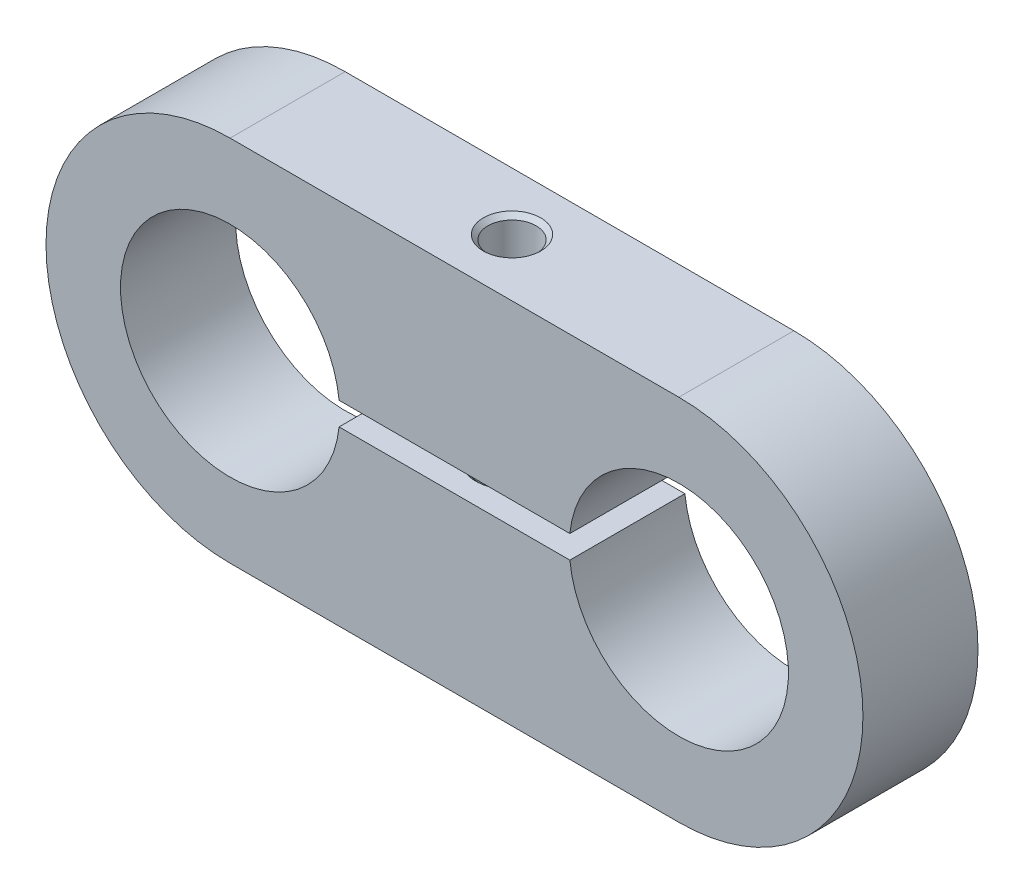
ISO-10303-21;
HEADER;
FILE_DESCRIPTION(('STEP AP214'),'2;1');
FILE_NAME('part.step','',(''),(''),'','','');
FILE_SCHEMA(('AUTOMOTIVE_DESIGN { 1 0 10303 214 1 1 1 1 }'));
ENDSEC;
DATA;
#1=APPLICATION_CONTEXT('core data for automotive mechanical design processes');
#2=APPLICATION_PROTOCOL_DEFINITION('international standard','automotive_design',2000,#1);
#3=PRODUCT_CONTEXT('',#1,'mechanical');
#4=PRODUCT('Part','Part','',(#3));
#5=PRODUCT_RELATED_PRODUCT_CATEGORY('part','',(#4));
#6=PRODUCT_DEFINITION_FORMATION('','',#4);
#7=PRODUCT_DEFINITION_CONTEXT('part definition',#1,'design');
#8=PRODUCT_DEFINITION('design','',#6,#7);
#9=PRODUCT_DEFINITION_SHAPE('','',#8);
#10=(LENGTH_UNIT() NAMED_UNIT(*) SI_UNIT(.MILLI.,.METRE.));
#11=(NAMED_UNIT(*) PLANE_ANGLE_UNIT() SI_UNIT($,.RADIAN.));
#12=(NAMED_UNIT(*) SI_UNIT($,.STERADIAN.) SOLID_ANGLE_UNIT());
#13=UNCERTAINTY_MEASURE_WITH_UNIT(LENGTH_MEASURE(1.E-05),#10,'distance_accuracy_value','');
#14=(GEOMETRIC_REPRESENTATION_CONTEXT(3) GLOBAL_UNCERTAINTY_ASSIGNED_CONTEXT((#13)) GLOBAL_UNIT_ASSIGNED_CONTEXT((#10,
#11,#12)) REPRESENTATION_CONTEXT('',''));
#15=CARTESIAN_POINT('',(0.,0.,0.));
#16=DIRECTION('',(0.,0.,1.));
#17=DIRECTION('',(1.,0.,0.));
#18=AXIS2_PLACEMENT_3D('',#15,#16,#17);
#19=CARTESIAN_POINT('',(0.,0.,10.));
#20=DIRECTION('',(0.,0.,-1.));
#21=DIRECTION('',(-1.,0.,0.));
#22=AXIS2_PLACEMENT_3D('',#19,#20,#21);
#23=CYLINDRICAL_SURFACE('',#22,16.);
#24=CARTESIAN_POINT('',(0.,0.,0.));
#25=DIRECTION('',(0.,0.,-1.));
#26=DIRECTION('',(-1.,0.,0.));
#27=AXIS2_PLACEMENT_3D('',#24,#25,#26);
#28=CIRCLE('',#27,16.);
#29=CARTESIAN_POINT('',(0.,-16.,0.));
#30=VERTEX_POINT('',#29);
#31=CARTESIAN_POINT('',(0.,16.,0.));
#32=VERTEX_POINT('',#31);
#33=EDGE_CURVE('E123',#30,#32,#28,.T.);
#34=ORIENTED_EDGE('',*,*,#33,.F.);
#35=DIRECTION('',(0.,0.,-1.));
#36=VECTOR('',#35,1.);
#37=CARTESIAN_POINT('',(0.,-16.,10.));
#38=LINE('',#37,#36);
#39=CARTESIAN_POINT('',(0.,-16.,10.));
#40=VERTEX_POINT('',#39);
#41=EDGE_CURVE('E54',#40,#30,#38,.T.);
#42=ORIENTED_EDGE('',*,*,#41,.F.);
#43=CARTESIAN_POINT('',(0.,0.,10.));
#44=DIRECTION('',(0.,0.,-1.));
#45=DIRECTION('',(-1.,0.,0.));
#46=AXIS2_PLACEMENT_3D('',#43,#44,#45);
#47=CIRCLE('',#46,16.);
#48=CARTESIAN_POINT('',(0.,16.,10.));
#49=VERTEX_POINT('',#48);
#50=EDGE_CURVE('E156',#40,#49,#47,.T.);
#51=ORIENTED_EDGE('',*,*,#50,.T.);
#52=DIRECTION('',(0.,0.,-1.));
#53=VECTOR('',#52,1.);
#54=CARTESIAN_POINT('',(0.,16.,10.));
#55=LINE('',#54,#53);
#56=EDGE_CURVE('E83',#49,#32,#55,.T.);
#57=ORIENTED_EDGE('',*,*,#56,.T.);
#58=EDGE_LOOP('',(#34,#42,#51,#57));
#59=FACE_BOUND('',#58,.T.);
#60=ADVANCED_FACE('F37',(#59),#23,.T.);
#61=CARTESIAN_POINT('',(39.,-16.,10.));
#62=DIRECTION('',(0.,-1.,0.));
#63=DIRECTION('',(0.,0.,-1.));
#64=AXIS2_PLACEMENT_3D('',#61,#62,#63);
#65=PLANE('',#64);
#66=CARTESIAN_POINT('',(19.5,-16.,5.));
#67=DIRECTION('',(0.,-1.,0.));
#68=DIRECTION('',(0.,0.,-1.));
#69=AXIS2_PLACEMENT_3D('',#66,#67,#68);
#70=CIRCLE('',#69,3.14999999961537);
#71=CARTESIAN_POINT('',(19.5,-16.,1.85000000038463));
#72=VERTEX_POINT('',#71);
#73=EDGE_CURVE('E11',#72,#72,#70,.F.);
#74=ORIENTED_EDGE('',*,*,#73,.T.);
#75=EDGE_LOOP('',(#74));
#76=FACE_BOUND('',#75,.T.);
#77=DIRECTION('',(-1.,0.,0.));
#78=VECTOR('',#77,1.);
#79=CARTESIAN_POINT('',(39.,-16.,0.));
#80=LINE('',#79,#78);
#81=CARTESIAN_POINT('',(39.,-16.,0.));
#82=VERTEX_POINT('',#81);
#83=EDGE_CURVE('E159',#82,#30,#80,.T.);
#84=ORIENTED_EDGE('',*,*,#83,.F.);
#85=DIRECTION('',(0.,0.,-1.));
#86=VECTOR('',#85,1.);
#87=CARTESIAN_POINT('',(39.,-16.,10.));
#88=LINE('',#87,#86);
#89=CARTESIAN_POINT('',(39.,-16.,10.));
#90=VERTEX_POINT('',#89);
#91=EDGE_CURVE('E72',#90,#82,#88,.T.);
#92=ORIENTED_EDGE('',*,*,#91,.F.);
#93=DIRECTION('',(-1.,0.,0.));
#94=VECTOR('',#93,1.);
#95=CARTESIAN_POINT('',(39.,-16.,10.));
#96=LINE('',#95,#94);
#97=EDGE_CURVE('E163',#90,#40,#96,.T.);
#98=ORIENTED_EDGE('',*,*,#97,.T.);
#99=ORIENTED_EDGE('',*,*,#41,.T.);
#100=EDGE_LOOP('',(#84,#92,#98,#99));
#101=FACE_BOUND('',#100,.T.);
#102=ADVANCED_FACE('F224',(#76,#101),#65,.T.);
#103=CARTESIAN_POINT('',(39.,0.,10.));
#104=DIRECTION('',(0.,0.,-1.));
#105=DIRECTION('',(-1.,0.,0.));
#106=AXIS2_PLACEMENT_3D('',#103,#104,#105);
#107=CYLINDRICAL_SURFACE('',#106,16.);
#108=CARTESIAN_POINT('',(39.,0.,0.));
#109=DIRECTION('',(0.,0.,-1.));
#110=DIRECTION('',(-1.,0.,0.));
#111=AXIS2_PLACEMENT_3D('',#108,#109,#110);
#112=CIRCLE('',#111,16.);
#113=CARTESIAN_POINT('',(39.,16.,0.));
#114=VERTEX_POINT('',#113);
#115=EDGE_CURVE('E170',#114,#82,#112,.T.);
#116=ORIENTED_EDGE('',*,*,#115,.F.);
#117=DIRECTION('',(0.,0.,-1.));
#118=VECTOR('',#117,1.);
#119=CARTESIAN_POINT('',(39.,16.,10.));
#120=LINE('',#119,#118);
#121=CARTESIAN_POINT('',(39.,16.,10.));
#122=VERTEX_POINT('',#121);
#123=EDGE_CURVE('E177',#122,#114,#120,.T.);
#124=ORIENTED_EDGE('',*,*,#123,.F.);
#125=CARTESIAN_POINT('',(39.,0.,10.));
#126=DIRECTION('',(0.,0.,-1.));
#127=DIRECTION('',(-1.,0.,0.));
#128=AXIS2_PLACEMENT_3D('',#125,#126,#127);
#129=CIRCLE('',#128,16.);
#130=EDGE_CURVE('E161',#122,#90,#129,.T.);
#131=ORIENTED_EDGE('',*,*,#130,.T.);
#132=ORIENTED_EDGE('',*,*,#91,.T.);
#133=EDGE_LOOP('',(#116,#124,#131,#132));
#134=FACE_BOUND('',#133,.T.);
#135=ADVANCED_FACE('F229',(#134),#107,.T.);
#136=CARTESIAN_POINT('',(0.,16.,10.));
#137=DIRECTION('',(0.,1.,0.));
#138=DIRECTION('',(-1.,0.,0.));
#139=AXIS2_PLACEMENT_3D('',#136,#137,#138);
#140=PLANE('',#139);
#141=CARTESIAN_POINT('',(19.5,16.,5.));
#142=DIRECTION('',(0.,1.,0.));
#143=DIRECTION('',(-1.,0.,0.));
#144=AXIS2_PLACEMENT_3D('',#141,#142,#143);
#145=CIRCLE('',#144,2.49999999961536);
#146=CARTESIAN_POINT('',(17.0000000003846,16.,5.));
#147=VERTEX_POINT('',#146);
#148=EDGE_CURVE('E46',#147,#147,#145,.F.);
#149=ORIENTED_EDGE('',*,*,#148,.T.);
#150=EDGE_LOOP('',(#149));
#151=FACE_BOUND('',#150,.T.);
#152=DIRECTION('',(1.,0.,0.));
#153=VECTOR('',#152,1.);
#154=CARTESIAN_POINT('',(0.,16.,0.));
#155=LINE('',#154,#153);
#156=EDGE_CURVE('E167',#32,#114,#155,.T.);
#157=ORIENTED_EDGE('',*,*,#156,.F.);
#158=ORIENTED_EDGE('',*,*,#56,.F.);
#159=DIRECTION('',(1.,0.,0.));
#160=VECTOR('',#159,1.);
#161=CARTESIAN_POINT('',(0.,16.,10.));
#162=LINE('',#161,#160);
#163=EDGE_CURVE('E158',#49,#122,#162,.T.);
#164=ORIENTED_EDGE('',*,*,#163,.T.);
#165=ORIENTED_EDGE('',*,*,#123,.T.);
#166=EDGE_LOOP('',(#157,#158,#164,#165));
#167=FACE_BOUND('',#166,.T.);
#168=ADVANCED_FACE('F199',(#151,#167),#140,.T.);
#169=CARTESIAN_POINT('',(0.,0.,10.));
#170=DIRECTION('',(0.,0.,-1.));
#171=DIRECTION('',(-1.,0.,0.));
#172=AXIS2_PLACEMENT_3D('',#169,#170,#171);
#173=PLANE('',#172);
#174=DIRECTION('',(1.,0.,0.));
#175=VECTOR('',#174,1.);
#176=CARTESIAN_POINT('',(10.9544511501033,-0.999999999999987,10.));
#177=LINE('',#176,#175);
#178=CARTESIAN_POINT('',(9.47236111009288,-0.999999999999992,10.));
#179=VERTEX_POINT('',#178);
#180=CARTESIAN_POINT('',(29.5276388899071,-0.999999999999992,10.));
#181=VERTEX_POINT('',#180);
#182=EDGE_CURVE('E129',#179,#181,#177,.T.);
#183=ORIENTED_EDGE('',*,*,#182,.F.);
#184=CARTESIAN_POINT('',(0.,0.,10.));
#185=DIRECTION('',(0.,0.,-1.));
#186=DIRECTION('',(1.,0.,0.));
#187=AXIS2_PLACEMENT_3D('',#184,#185,#186);
#188=CIRCLE('',#187,9.525);
#189=CARTESIAN_POINT('',(9.47236111009288,1.,10.));
#190=VERTEX_POINT('',#189);
#191=EDGE_CURVE('E142',#179,#190,#188,.T.);
#192=ORIENTED_EDGE('',*,*,#191,.T.);
#193=DIRECTION('',(-1.,0.,0.));
#194=VECTOR('',#193,1.);
#195=CARTESIAN_POINT('',(28.0455488498967,1.,10.));
#196=LINE('',#195,#194);
#197=CARTESIAN_POINT('',(29.5276388899071,1.,10.));
#198=VERTEX_POINT('',#197);
#199=EDGE_CURVE('E150',#198,#190,#196,.T.);
#200=ORIENTED_EDGE('',*,*,#199,.F.);
#201=CARTESIAN_POINT('',(39.,0.,10.));
#202=DIRECTION('',(0.,0.,-1.));
#203=DIRECTION('',(-1.,0.,0.));
#204=AXIS2_PLACEMENT_3D('',#201,#202,#203);
#205=CIRCLE('',#204,9.525);
#206=EDGE_CURVE('E138',#198,#181,#205,.T.);
#207=ORIENTED_EDGE('',*,*,#206,.T.);
#208=EDGE_LOOP('',(#183,#192,#200,#207));
#209=FACE_BOUND('',#208,.T.);
#210=ORIENTED_EDGE('',*,*,#50,.F.);
#211=ORIENTED_EDGE('',*,*,#97,.F.);
#212=ORIENTED_EDGE('',*,*,#130,.F.);
#213=ORIENTED_EDGE('',*,*,#163,.F.);
#214=EDGE_LOOP('',(#210,#211,#212,#213));
#215=FACE_BOUND('',#214,.T.);
#216=ADVANCED_FACE('F251',(#209,#215),#173,.F.);
#217=CARTESIAN_POINT('',(0.,0.,0.));
#218=DIRECTION('',(0.,0.,-1.));
#219=DIRECTION('',(-1.,0.,0.));
#220=AXIS2_PLACEMENT_3D('',#217,#218,#219);
#221=PLANE('',#220);
#222=DIRECTION('',(-1.,0.,0.));
#223=VECTOR('',#222,1.);
#224=CARTESIAN_POINT('',(28.0455488498967,1.,0.));
#225=LINE('',#224,#223);
#226=CARTESIAN_POINT('',(29.5276388899071,1.,0.));
#227=VERTEX_POINT('',#226);
#228=CARTESIAN_POINT('',(9.47236111009288,1.,0.));
#229=VERTEX_POINT('',#228);
#230=EDGE_CURVE('E124',#227,#229,#225,.T.);
#231=ORIENTED_EDGE('',*,*,#230,.T.);
#232=CARTESIAN_POINT('',(0.,0.,0.));
#233=DIRECTION('',(0.,0.,-1.));
#234=DIRECTION('',(1.,0.,0.));
#235=AXIS2_PLACEMENT_3D('',#232,#233,#234);
#236=CIRCLE('',#235,9.525);
#237=CARTESIAN_POINT('',(9.47236111009288,-0.999999999999992,0.));
#238=VERTEX_POINT('',#237);
#239=EDGE_CURVE('E119',#238,#229,#236,.T.);
#240=ORIENTED_EDGE('',*,*,#239,.F.);
#241=DIRECTION('',(1.,0.,0.));
#242=VECTOR('',#241,1.);
#243=CARTESIAN_POINT('',(10.9544511501033,-0.999999999999987,0.));
#244=LINE('',#243,#242);
#245=CARTESIAN_POINT('',(29.5276388899071,-0.999999999999992,0.));
#246=VERTEX_POINT('',#245);
#247=EDGE_CURVE('E112',#238,#246,#244,.T.);
#248=ORIENTED_EDGE('',*,*,#247,.T.);
#249=CARTESIAN_POINT('',(39.,0.,0.));
#250=DIRECTION('',(0.,0.,-1.));
#251=DIRECTION('',(-1.,0.,0.));
#252=AXIS2_PLACEMENT_3D('',#249,#250,#251);
#253=CIRCLE('',#252,9.525);
#254=EDGE_CURVE('E117',#227,#246,#253,.T.);
#255=ORIENTED_EDGE('',*,*,#254,.F.);
#256=EDGE_LOOP('',(#231,#240,#248,#255));
#257=FACE_BOUND('',#256,.T.);
#258=ORIENTED_EDGE('',*,*,#33,.T.);
#259=ORIENTED_EDGE('',*,*,#156,.T.);
#260=ORIENTED_EDGE('',*,*,#115,.T.);
#261=ORIENTED_EDGE('',*,*,#83,.T.);
#262=EDGE_LOOP('',(#258,#259,#260,#261));
#263=FACE_BOUND('',#262,.T.);
#264=ADVANCED_FACE('F114',(#257,#263),#221,.T.);
#265=CARTESIAN_POINT('',(10.9544511501033,-0.999999999999987,0.));
#266=DIRECTION('',(0.,-1.,0.));
#267=DIRECTION('',(0.,0.,-1.));
#268=AXIS2_PLACEMENT_3D('',#265,#266,#267);
#269=PLANE('',#268);
#270=CARTESIAN_POINT('',(19.5,-0.999999999999987,5.));
#271=DIRECTION('',(0.,-1.,0.));
#272=DIRECTION('',(0.,0.,-1.));
#273=AXIS2_PLACEMENT_3D('',#270,#271,#272);
#274=CIRCLE('',#273,3.15000000035431);
#275=CARTESIAN_POINT('',(19.5,-0.999999999999987,1.84999999964569));
#276=VERTEX_POINT('',#275);
#277=EDGE_CURVE('E175',#276,#276,#274,.T.);
#278=ORIENTED_EDGE('',*,*,#277,.T.);
#279=EDGE_LOOP('',(#278));
#280=FACE_BOUND('',#279,.T.);
#281=ORIENTED_EDGE('',*,*,#182,.T.);
#282=DIRECTION('',(0.,0.,1.));
#283=VECTOR('',#282,1.);
#284=CARTESIAN_POINT('',(29.5276388899071,-0.999999999999992,0.));
#285=LINE('',#284,#283);
#286=EDGE_CURVE('E127',#246,#181,#285,.T.);
#287=ORIENTED_EDGE('',*,*,#286,.F.);
#288=ORIENTED_EDGE('',*,*,#247,.F.);
#289=DIRECTION('',(0.,0.,1.));
#290=VECTOR('',#289,1.);
#291=CARTESIAN_POINT('',(9.47236111009288,-0.999999999999992,0.));
#292=LINE('',#291,#290);
#293=EDGE_CURVE('E148',#238,#179,#292,.T.);
#294=ORIENTED_EDGE('',*,*,#293,.T.);
#295=EDGE_LOOP('',(#281,#287,#288,#294));
#296=FACE_BOUND('',#295,.T.);
#297=ADVANCED_FACE('F128',(#280,#296),#269,.F.);
#298=CARTESIAN_POINT('',(28.0455488498967,1.,0.));
#299=DIRECTION('',(0.,1.,0.));
#300=DIRECTION('',(0.,0.,1.));
#301=AXIS2_PLACEMENT_3D('',#298,#299,#300);
#302=PLANE('',#301);
#303=CARTESIAN_POINT('',(19.5,1.,5.));
#304=DIRECTION('',(0.,1.,0.));
#305=DIRECTION('',(0.,0.,1.));
#306=AXIS2_PLACEMENT_3D('',#303,#304,#305);
#307=CIRCLE('',#306,2.50000000035432);
#308=CARTESIAN_POINT('',(19.5,1.,7.50000000035432));
#309=VERTEX_POINT('',#308);
#310=EDGE_CURVE('E188',#309,#309,#307,.T.);
#311=ORIENTED_EDGE('',*,*,#310,.T.);
#312=EDGE_LOOP('',(#311));
#313=FACE_BOUND('',#312,.T.);
#314=ORIENTED_EDGE('',*,*,#199,.T.);
#315=DIRECTION('',(0.,0.,1.));
#316=VECTOR('',#315,1.);
#317=CARTESIAN_POINT('',(9.47236111009288,1.,0.));
#318=LINE('',#317,#316);
#319=EDGE_CURVE('E145',#229,#190,#318,.T.);
#320=ORIENTED_EDGE('',*,*,#319,.F.);
#321=ORIENTED_EDGE('',*,*,#230,.F.);
#322=DIRECTION('',(0.,0.,1.));
#323=VECTOR('',#322,1.);
#324=CARTESIAN_POINT('',(29.5276388899071,1.,0.));
#325=LINE('',#324,#323);
#326=EDGE_CURVE('E133',#227,#198,#325,.T.);
#327=ORIENTED_EDGE('',*,*,#326,.T.);
#328=EDGE_LOOP('',(#314,#320,#321,#327));
#329=FACE_BOUND('',#328,.T.);
#330=ADVANCED_FACE('F219',(#313,#329),#302,.F.);
#331=CARTESIAN_POINT('',(19.5,-16.,5.));
#332=DIRECTION('',(0.,-1.,0.));
#333=DIRECTION('',(0.,0.,-1.));
#334=AXIS2_PLACEMENT_3D('',#331,#332,#333);
#335=CYLINDRICAL_SURFACE('',#334,2.74999999999999);
#336=CARTESIAN_POINT('',(19.5,-1.39999999961535,5.));
#337=DIRECTION('',(0.,-1.,0.));
#338=DIRECTION('',(0.,0.,-1.));
#339=AXIS2_PLACEMENT_3D('',#336,#337,#338);
#340=CIRCLE('',#339,2.74999999999999);
#341=CARTESIAN_POINT('',(19.5,-1.39999999961535,2.25000000000001));
#342=VERTEX_POINT('',#341);
#343=EDGE_CURVE('E185',#342,#342,#340,.F.);
#344=ORIENTED_EDGE('',*,*,#343,.T.);
#345=EDGE_LOOP('',(#344));
#346=FACE_BOUND('',#345,.T.);
#347=CARTESIAN_POINT('',(19.5,-15.5999999996457,5.));
#348=DIRECTION('',(0.,-1.,0.));
#349=DIRECTION('',(0.,0.,-1.));
#350=AXIS2_PLACEMENT_3D('',#347,#348,#349);
#351=CIRCLE('',#350,2.74999999999999);
#352=CARTESIAN_POINT('',(19.5,-15.5999999996457,2.25000000000001));
#353=VERTEX_POINT('',#352);
#354=EDGE_CURVE('E182',#353,#353,#351,.T.);
#355=ORIENTED_EDGE('',*,*,#354,.T.);
#356=EDGE_LOOP('',(#355));
#357=FACE_BOUND('',#356,.T.);
#358=ADVANCED_FACE('F210',(#346,#357),#335,.F.);
#359=CARTESIAN_POINT('',(19.5,16.,5.));
#360=DIRECTION('',(0.,1.,0.));
#361=DIRECTION('',(0.,0.,1.));
#362=AXIS2_PLACEMENT_3D('',#359,#360,#361);
#363=CYLINDRICAL_SURFACE('',#362,2.09999999999999);
#364=CARTESIAN_POINT('',(19.5,1.39999999961537,5.));
#365=DIRECTION('',(0.,1.,0.));
#366=DIRECTION('',(0.,0.,1.));
#367=AXIS2_PLACEMENT_3D('',#364,#365,#366);
#368=CIRCLE('',#367,2.09999999999999);
#369=CARTESIAN_POINT('',(19.5,1.39999999961537,7.09999999999999));
#370=VERTEX_POINT('',#369);
#371=EDGE_CURVE('E194',#370,#370,#368,.F.);
#372=ORIENTED_EDGE('',*,*,#371,.T.);
#373=EDGE_LOOP('',(#372));
#374=FACE_BOUND('',#373,.T.);
#375=CARTESIAN_POINT('',(19.5,15.5999999996457,5.));
#376=DIRECTION('',(0.,1.,0.));
#377=DIRECTION('',(0.,0.,1.));
#378=AXIS2_PLACEMENT_3D('',#375,#376,#377);
#379=CIRCLE('',#378,2.09999999999999);
#380=CARTESIAN_POINT('',(19.5,15.5999999996457,7.09999999999999));
#381=VERTEX_POINT('',#380);
#382=EDGE_CURVE('E191',#381,#381,#379,.T.);
#383=ORIENTED_EDGE('',*,*,#382,.T.);
#384=EDGE_LOOP('',(#383));
#385=FACE_BOUND('',#384,.T.);
#386=ADVANCED_FACE('F207',(#374,#385),#363,.F.);
#387=CARTESIAN_POINT('',(19.5,-0.999999999999987,5.));
#388=DIRECTION('',(0.,1.,0.));
#389=DIRECTION('',(0.,0.,1.));
#390=AXIS2_PLACEMENT_3D('',#387,#388,#389);
#391=CONICAL_SURFACE('',#390,3.15000000035431,0.785398164321151);
#392=ORIENTED_EDGE('',*,*,#343,.F.);
#393=EDGE_LOOP('',(#392));
#394=FACE_BOUND('',#393,.T.);
#395=ORIENTED_EDGE('',*,*,#277,.F.);
#396=EDGE_LOOP('',(#395));
#397=FACE_BOUND('',#396,.T.);
#398=ADVANCED_FACE('F209',(#394,#397),#391,.F.);
#399=CARTESIAN_POINT('',(19.5,1.,5.));
#400=DIRECTION('',(0.,-1.,0.));
#401=DIRECTION('',(0.,0.,-1.));
#402=AXIS2_PLACEMENT_3D('',#399,#400,#401);
#403=CONICAL_SURFACE('',#402,2.50000000035432,0.785398164321154);
#404=ORIENTED_EDGE('',*,*,#371,.F.);
#405=EDGE_LOOP('',(#404));
#406=FACE_BOUND('',#405,.T.);
#407=ORIENTED_EDGE('',*,*,#310,.F.);
#408=EDGE_LOOP('',(#407));
#409=FACE_BOUND('',#408,.T.);
#410=ADVANCED_FACE('F204',(#406,#409),#403,.F.);
#411=CARTESIAN_POINT('',(19.5,15.5999999996457,5.));
#412=DIRECTION('',(0.,1.,0.));
#413=DIRECTION('',(0.,0.,1.));
#414=AXIS2_PLACEMENT_3D('',#411,#412,#413);
#415=CONICAL_SURFACE('',#414,2.09999999999999,0.785398162473745);
#416=ORIENTED_EDGE('',*,*,#148,.F.);
#417=EDGE_LOOP('',(#416));
#418=FACE_BOUND('',#417,.T.);
#419=ORIENTED_EDGE('',*,*,#382,.F.);
#420=EDGE_LOOP('',(#419));
#421=FACE_BOUND('',#420,.T.);
#422=ADVANCED_FACE('F201',(#418,#421),#415,.F.);
#423=CARTESIAN_POINT('',(19.5,-15.5999999996457,5.));
#424=DIRECTION('',(0.,-1.,0.));
#425=DIRECTION('',(0.,0.,-1.));
#426=AXIS2_PLACEMENT_3D('',#423,#424,#425);
#427=CONICAL_SURFACE('',#426,2.74999999999999,0.785398162473744);
#428=CARTESIAN_POINT('',(19.5,-16.,1.85000000038463));
#429=CARTESIAN_POINT('',(19.5,-15.9958333333296,1.85416666704729));
#430=CARTESIAN_POINT('',(19.5,-15.9916666666593,1.85833333370995));
#431=CARTESIAN_POINT('',(19.5,-15.9833333333186,1.86666666703527));
#432=CARTESIAN_POINT('',(19.5,-15.9791666666482,1.87083333369793));
#433=CARTESIAN_POINT('',(19.5,-15.9708333333075,1.87916666702325));
#434=CARTESIAN_POINT('',(19.5,-15.9666666666371,1.88333333368591));
#435=CARTESIAN_POINT('',(19.5,-15.9583333332964,1.89166666701123));
#436=CARTESIAN_POINT('',(19.5,-15.9541666666261,1.89583333367389));
#437=CARTESIAN_POINT('',(19.5,-15.9458333332853,1.90416666699921));
#438=CARTESIAN_POINT('',(19.5,-15.941666666615,1.90833333366187));
#439=CARTESIAN_POINT('',(19.5,-15.9333333332743,1.91666666698719));
#440=CARTESIAN_POINT('',(19.5,-15.9291666666039,1.92083333364985));
#441=CARTESIAN_POINT('',(19.5,-15.9208333332632,1.92916666697517));
#442=CARTESIAN_POINT('',(19.5,-15.9166666665928,1.93333333363783));
#443=CARTESIAN_POINT('',(19.5,-15.9083333332521,1.94166666696316));
#444=CARTESIAN_POINT('',(19.5,-15.9041666665818,1.94583333362582));
#445=CARTESIAN_POINT('',(19.5,-15.8958333332411,1.95416666695114));
#446=CARTESIAN_POINT('',(19.5,-15.8916666665707,1.9583333336138));
#447=CARTESIAN_POINT('',(19.5,-15.88333333323,1.96666666693912));
#448=CARTESIAN_POINT('',(19.5,-15.8791666665596,1.97083333360178));
#449=CARTESIAN_POINT('',(19.5,-15.8708333332189,1.9791666669271));
#450=CARTESIAN_POINT('',(19.5,-15.8666666665486,1.98333333358976));
#451=CARTESIAN_POINT('',(19.5,-15.8583333332078,1.99166666691508));
#452=CARTESIAN_POINT('',(19.5,-15.8541666665375,1.99583333357774));
#453=CARTESIAN_POINT('',(19.5,-15.8458333331968,2.00416666690306));
#454=CARTESIAN_POINT('',(19.5,-15.8416666665264,2.00833333356572));
#455=CARTESIAN_POINT('',(19.5,-15.8333333331857,2.01666666689104));
#456=CARTESIAN_POINT('',(19.5,-15.8291666665153,2.0208333335537));
#457=CARTESIAN_POINT('',(19.5,-15.8208333331746,2.02916666687902));
#458=CARTESIAN_POINT('',(19.5,-15.8166666665043,2.03333333354168));
#459=CARTESIAN_POINT('',(19.5,-15.8083333331635,2.041666666867));
#460=CARTESIAN_POINT('',(19.5,-15.8041666664932,2.04583333352966));
#461=CARTESIAN_POINT('',(19.5,-15.7958333331525,2.05416666685498));
#462=CARTESIAN_POINT('',(19.5,-15.7916666664821,2.05833333351764));
#463=CARTESIAN_POINT('',(19.5,-15.7833333331414,2.06666666684296));
#464=CARTESIAN_POINT('',(19.5,-15.779166666471,2.07083333350562));
#465=CARTESIAN_POINT('',(19.5,-15.7708333331303,2.07916666683094));
#466=CARTESIAN_POINT('',(19.5,-15.76666666646,2.0833333334936));
#467=CARTESIAN_POINT('',(19.5,-15.7583333331192,2.09166666681892));
#468=CARTESIAN_POINT('',(19.5,-15.7541666664489,2.09583333348158));
#469=CARTESIAN_POINT('',(19.5,-15.7458333331082,2.1041666668069));
#470=CARTESIAN_POINT('',(19.5,-15.7416666664378,2.10833333346956));
#471=CARTESIAN_POINT('',(19.5,-15.7333333330971,2.11666666679488));
#472=CARTESIAN_POINT('',(19.5,-15.7291666664267,2.12083333345754));
#473=CARTESIAN_POINT('',(19.5,-15.720833333086,2.12916666678286));
#474=CARTESIAN_POINT('',(19.5,-15.7166666664157,2.13333333344552));
#475=CARTESIAN_POINT('',(19.5,-15.708333333075,2.14166666677084));
#476=CARTESIAN_POINT('',(19.5,-15.7041666664046,2.1458333334335));
#477=CARTESIAN_POINT('',(19.5,-15.6958333330639,2.15416666675882));
#478=CARTESIAN_POINT('',(19.5,-15.6916666663935,2.15833333342148));
#479=CARTESIAN_POINT('',(19.5,-15.6833333330528,2.16666666674681));
#480=CARTESIAN_POINT('',(19.5,-15.6791666663825,2.17083333340946));
#481=CARTESIAN_POINT('',(19.5,-15.6708333330417,2.17916666673479));
#482=CARTESIAN_POINT('',(19.5,-15.6666666663714,2.18333333339745));
#483=CARTESIAN_POINT('',(19.5,-15.6583333330307,2.19166666672277));
#484=CARTESIAN_POINT('',(19.5,-15.6541666663603,2.19583333338543));
#485=CARTESIAN_POINT('',(19.5,-15.6458333330196,2.20416666671075));
#486=CARTESIAN_POINT('',(19.5,-15.6416666663492,2.20833333337341));
#487=CARTESIAN_POINT('',(19.5,-15.6333333330085,2.21666666669873));
#488=CARTESIAN_POINT('',(19.5,-15.6291666663382,2.22083333336139));
#489=CARTESIAN_POINT('',(19.5,-15.6208333329974,2.22916666668671));
#490=CARTESIAN_POINT('',(19.5,-15.6166666663271,2.23333333334937));
#491=CARTESIAN_POINT('',(19.5,-15.6083333329864,2.24166666667469));
#492=CARTESIAN_POINT('',(19.5,-15.604166666316,2.24583333333735));
#493=CARTESIAN_POINT('',(19.5,-15.5999999996457,2.25000000000001));
#494=B_SPLINE_CURVE_WITH_KNOTS('',3,(#428,#429,#430,#431,#432,#433,#434,#435,#436,#437,#438,
#439,#440,#441,#442,#443,#444,#445,#446,#447,#448,#449,#450,#451,#452,#453,#454,#455,#456,#457,
#458,#459,#460,#461,#462,#463,#464,#465,#466,#467,#468,#469,#470,#471,#472,#473,#474,#475,#476,
#477,#478,#479,#480,#481,#482,#483,#484,#485,#486,#487,#488,#489,#490,#491,#492,#493),
.UNSPECIFIED.,.F.,.F.,(4,2,2,2,2,2,2,2,2,2,2,2,2,2,2,2,2,2,2,2,2,2,2,2,2,2,2,2,2,2,2,2,4),(0.,
0.0176776695289945,0.0353553390579889,0.0530330085869837,0.0707106781159781,0.0883883476449726,
0.106066017173967,0.123743686702962,0.141421356231956,0.159099025760951,0.176776695289945,
0.19445436481894,0.212132034347934,0.229809703876929,0.247487373405924,0.265165042934918,
0.282842712463912,0.300520381992907,0.318198051521901,0.335875721050896,0.353553390579891,
0.371231060108885,0.38890872963788,0.406586399166874,0.424264068695869,0.441941738224863,
0.459619407753857,0.477297077282852,0.494974746811847,0.512652416340841,0.530330085869836,
0.54800775539883,0.565685424927825),.UNSPECIFIED.);
#495=EDGE_CURVE('BSEAM39',#72,#353,#494,.T.);
#496=ORIENTED_EDGE('',*,*,#73,.F.);
#497=ORIENTED_EDGE('',*,*,#354,.F.);
#498=ORIENTED_EDGE('',*,*,#495,.T.);
#499=ORIENTED_EDGE('',*,*,#495,.F.);
#500=EDGE_LOOP('',(#496,#498,#497,#499));
#501=FACE_BOUND('',#500,.T.);
#502=ADVANCED_FACE('F39',(#501),#427,.F.);
#503=CARTESIAN_POINT('',(0.,0.,0.));
#504=DIRECTION('',(0.,0.,1.));
#505=DIRECTION('',(1.,0.,0.));
#506=AXIS2_PLACEMENT_3D('',#503,#504,#505);
#507=CYLINDRICAL_SURFACE('',#506,9.525);
#508=ORIENTED_EDGE('',*,*,#191,.F.);
#509=ORIENTED_EDGE('',*,*,#293,.F.);
#510=ORIENTED_EDGE('',*,*,#239,.T.);
#511=ORIENTED_EDGE('',*,*,#319,.T.);
#512=EDGE_LOOP('',(#508,#509,#510,#511));
#513=FACE_BOUND('',#512,.T.);
#514=ADVANCED_FACE('F250',(#513),#507,.F.);
#515=CARTESIAN_POINT('',(39.,0.,0.));
#516=DIRECTION('',(0.,0.,1.));
#517=DIRECTION('',(1.,0.,0.));
#518=AXIS2_PLACEMENT_3D('',#515,#516,#517);
#519=CYLINDRICAL_SURFACE('',#518,9.525);
#520=ORIENTED_EDGE('',*,*,#206,.F.);
#521=ORIENTED_EDGE('',*,*,#326,.F.);
#522=ORIENTED_EDGE('',*,*,#254,.T.);
#523=ORIENTED_EDGE('',*,*,#286,.T.);
#524=EDGE_LOOP('',(#520,#521,#522,#523));
#525=FACE_BOUND('',#524,.T.);
#526=ADVANCED_FACE('F136',(#525),#519,.F.);
#527=CLOSED_SHELL('',(#60,#102,#135,#168,#216,#264,#297,#330,#358,#386,#398,#410,#422,#502,#514,#526));
#528=MANIFOLD_SOLID_BREP('B2',#527);
#529=ADVANCED_BREP_SHAPE_REPRESENTATION('',(#18,#528),#14);
#530=SHAPE_DEFINITION_REPRESENTATION(#9,#529);
ENDSEC;
END-ISO-10303-21;
